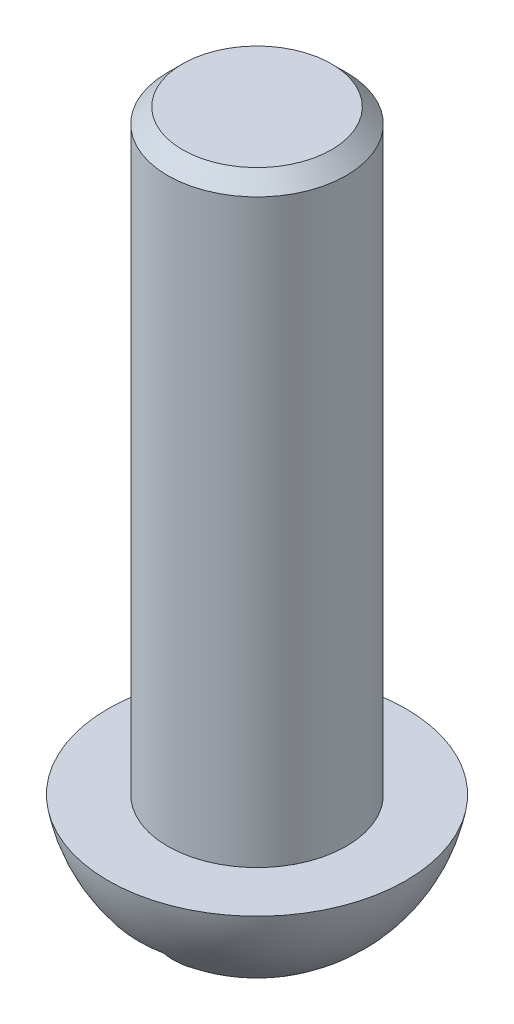
ISO-10303-21;
HEADER;
FILE_DESCRIPTION(('STEP AP214'),'2;1');
FILE_NAME('part.step','',(''),(''),'','','');
FILE_SCHEMA(('AUTOMOTIVE_DESIGN { 1 0 10303 214 1 1 1 1 }'));
ENDSEC;
DATA;
#1=APPLICATION_CONTEXT('core data for automotive mechanical design processes');
#2=APPLICATION_PROTOCOL_DEFINITION('international standard','automotive_design',2000,#1);
#3=PRODUCT_CONTEXT('',#1,'mechanical');
#4=PRODUCT('Part','Part','',(#3));
#5=PRODUCT_RELATED_PRODUCT_CATEGORY('part','',(#4));
#6=PRODUCT_DEFINITION_FORMATION('','',#4);
#7=PRODUCT_DEFINITION_CONTEXT('part definition',#1,'design');
#8=PRODUCT_DEFINITION('design','',#6,#7);
#9=PRODUCT_DEFINITION_SHAPE('','',#8);
#10=(LENGTH_UNIT() NAMED_UNIT(*) SI_UNIT(.MILLI.,.METRE.));
#11=(NAMED_UNIT(*) PLANE_ANGLE_UNIT() SI_UNIT($,.RADIAN.));
#12=(NAMED_UNIT(*) SI_UNIT($,.STERADIAN.) SOLID_ANGLE_UNIT());
#13=UNCERTAINTY_MEASURE_WITH_UNIT(LENGTH_MEASURE(1.E-05),#10,'distance_accuracy_value','');
#14=(GEOMETRIC_REPRESENTATION_CONTEXT(3) GLOBAL_UNCERTAINTY_ASSIGNED_CONTEXT((#13)) GLOBAL_UNIT_ASSIGNED_CONTEXT((#10,
#11,#12)) REPRESENTATION_CONTEXT('',''));
#15=CARTESIAN_POINT('',(0.,0.,0.));
#16=DIRECTION('',(0.,0.,1.));
#17=DIRECTION('',(1.,0.,0.));
#18=AXIS2_PLACEMENT_3D('',#15,#16,#17);
#19=CARTESIAN_POINT('',(0.,20.,0.));
#20=DIRECTION('',(0.,-1.,0.));
#21=DIRECTION('',(0.,0.,-1.));
#22=AXIS2_PLACEMENT_3D('',#19,#20,#21);
#23=CYLINDRICAL_SURFACE('',#22,3.);
#24=CARTESIAN_POINT('',(0.,19.5,0.));
#25=DIRECTION('',(0.,1.,0.));
#26=DIRECTION('',(0.,0.,1.));
#27=AXIS2_PLACEMENT_3D('',#24,#25,#26);
#28=CIRCLE('',#27,3.);
#29=CARTESIAN_POINT('',(0.,19.5,3.));
#30=VERTEX_POINT('',#29);
#31=EDGE_CURVE('E67',#30,#30,#28,.F.);
#32=ORIENTED_EDGE('',*,*,#31,.T.);
#33=EDGE_LOOP('',(#32));
#34=FACE_BOUND('',#33,.T.);
#35=CARTESIAN_POINT('',(0.,0.,0.));
#36=DIRECTION('',(0.,-1.,0.));
#37=DIRECTION('',(0.,0.,-1.));
#38=AXIS2_PLACEMENT_3D('',#35,#36,#37);
#39=CIRCLE('',#38,3.);
#40=CARTESIAN_POINT('',(0.,0.,-3.));
#41=VERTEX_POINT('',#40);
#42=EDGE_CURVE('E115',#41,#41,#39,.T.);
#43=ORIENTED_EDGE('',*,*,#42,.F.);
#44=EDGE_LOOP('',(#43));
#45=FACE_BOUND('',#44,.T.);
#46=ADVANCED_FACE('F31',(#34,#45),#23,.T.);
#47=CARTESIAN_POINT('',(0.,20.,0.));
#48=DIRECTION('',(0.,1.,0.));
#49=DIRECTION('',(0.,0.,1.));
#50=AXIS2_PLACEMENT_3D('',#47,#48,#49);
#51=PLANE('',#50);
#52=CARTESIAN_POINT('',(0.,20.,0.));
#53=DIRECTION('',(0.,1.,0.));
#54=DIRECTION('',(0.,0.,1.));
#55=AXIS2_PLACEMENT_3D('',#52,#53,#54);
#56=CIRCLE('',#55,2.5);
#57=CARTESIAN_POINT('',(0.,20.,2.5));
#58=VERTEX_POINT('',#57);
#59=EDGE_CURVE('E116',#58,#58,#56,.T.);
#60=ORIENTED_EDGE('',*,*,#59,.T.);
#61=EDGE_LOOP('',(#60));
#62=FACE_BOUND('',#61,.T.);
#63=ADVANCED_FACE('F94',(#62),#51,.T.);
#64=CARTESIAN_POINT('',(0.,20.,0.));
#65=DIRECTION('',(0.,-1.,0.));
#66=DIRECTION('',(0.,0.,-1.));
#67=AXIS2_PLACEMENT_3D('',#64,#65,#66);
#68=CONICAL_SURFACE('',#67,2.5,0.785398163397445);
#69=ORIENTED_EDGE('',*,*,#31,.F.);
#70=EDGE_LOOP('',(#69));
#71=FACE_BOUND('',#70,.T.);
#72=ORIENTED_EDGE('',*,*,#59,.F.);
#73=EDGE_LOOP('',(#72));
#74=FACE_BOUND('',#73,.T.);
#75=ADVANCED_FACE('F33',(#71,#74),#68,.T.);
#76=CARTESIAN_POINT('',(0.,0.,0.));
#77=DIRECTION('',(0.,-1.,0.));
#78=DIRECTION('',(0.,0.,-1.));
#79=AXIS2_PLACEMENT_3D('',#76,#77,#78);
#80=PLANE('',#79);
#81=CARTESIAN_POINT('',(0.,0.,0.));
#82=DIRECTION('',(0.,-1.,0.));
#83=DIRECTION('',(0.,0.,-1.));
#84=AXIS2_PLACEMENT_3D('',#81,#82,#83);
#85=CIRCLE('',#84,5.);
#86=CARTESIAN_POINT('',(0.,0.,-5.));
#87=VERTEX_POINT('',#86);
#88=EDGE_CURVE('E112',#87,#87,#85,.T.);
#89=ORIENTED_EDGE('',*,*,#88,.F.);
#90=EDGE_LOOP('',(#89));
#91=FACE_BOUND('',#90,.T.);
#92=ORIENTED_EDGE('',*,*,#42,.T.);
#93=EDGE_LOOP('',(#92));
#94=FACE_BOUND('',#93,.T.);
#95=ADVANCED_FACE('F92',(#91,#94),#80,.F.);
#96=CARTESIAN_POINT('',(0.,0.899960912816035,0.));
#97=DIRECTION('',(0.,-1.,0.));
#98=DIRECTION('',(0.,0.,-1.));
#99=AXIS2_PLACEMENT_3D('',#96,#97,#98);
#100=DEGENERATE_TOROIDAL_SURFACE('',#99,0.0199671667654691,5.1,.F.);
#101=CARTESIAN_POINT('',(0.,-2.29,0.));
#102=DIRECTION('',(0.,1.,0.));
#103=DIRECTION('',(0.,0.,1.));
#104=AXIS2_PLACEMENT_3D('',#101,#102,#103);
#105=CIRCLE('',#104,3.95924750131992);
#106=CARTESIAN_POINT('',(0.760314969587838,-2.29,-3.88555812255185));
#107=VERTEX_POINT('',#106);
#108=CARTESIAN_POINT('',(-0.760314969587838,-2.29,-3.88555812255185));
#109=VERTEX_POINT('',#108);
#110=EDGE_CURVE('E43',#107,#109,#105,.T.);
#111=ORIENTED_EDGE('',*,*,#110,.T.);
#112=CARTESIAN_POINT('',(-0.760314969587838,-4.1399954151384,0.));
#113=CARTESIAN_POINT('',(-0.760314969587838,-4.13999344087987,0.127954484447501));
#114=CARTESIAN_POINT('',(-0.760314969587838,-4.13498141562252,0.255926062135231));
#115=CARTESIAN_POINT('',(-0.760314969587838,-4.11505814588028,0.511106661475434));
#116=CARTESIAN_POINT('',(-0.760314969587838,-4.10014304774899,0.638315366814414));
#117=CARTESIAN_POINT('',(-0.760314969587838,-4.0403544493666,1.02046433942791));
#118=CARTESIAN_POINT('',(-0.760314969587838,-3.98044147943282,1.27322449777022));
#119=CARTESIAN_POINT('',(-0.760314969587838,-3.8224189485576,1.76670741010857));
#120=CARTESIAN_POINT('',(-0.760314969587838,-3.72426032339572,2.00741425181834));
#121=CARTESIAN_POINT('',(-0.760314969587838,-3.48159440506023,2.49184024609138));
#122=CARTESIAN_POINT('',(-0.760314969587838,-3.33370961229713,2.73387908764595));
#123=CARTESIAN_POINT('',(-0.760314969587838,-2.9995318846736,3.18974248725964));
#124=CARTESIAN_POINT('',(-0.760314969587838,-2.81324054014648,3.40356821296257));
#125=CARTESIAN_POINT('',(-0.760314969587838,-2.40690487653745,3.79760633980726));
#126=CARTESIAN_POINT('',(-0.760314969587838,-2.18676430136764,3.97771952892062));
#127=CARTESIAN_POINT('',(-0.760314969587838,-1.7193745131856,4.29844448559408));
#128=CARTESIAN_POINT('',(-0.760314969587838,-1.47212479880118,4.43905552240699));
#129=CARTESIAN_POINT('',(-0.760314969587838,-0.957456587186097,4.6768239810918));
#130=CARTESIAN_POINT('',(-0.760314969587838,-0.690032113396351,4.77396846691863));
#131=CARTESIAN_POINT('',(-0.760314969587838,-0.142671158554893,4.92198462172544));
#132=CARTESIAN_POINT('',(-0.760314969587838,0.137265293589944,4.97285639760515));
#133=CARTESIAN_POINT('',(-0.760314969587838,0.701724418877609,5.02688618214177));
#134=CARTESIAN_POINT('',(-0.760314969587838,0.98624739605957,5.03004101453046));
#135=CARTESIAN_POINT('',(-0.760314969587838,1.55178457115843,4.98853913164834));
#136=CARTESIAN_POINT('',(-0.760314969587838,1.83279877037742,4.94388243412067));
#137=CARTESIAN_POINT('',(-0.760314969587838,2.38334377533671,4.80802421821285));
#138=CARTESIAN_POINT('',(-0.760314969587838,2.65287448591163,4.71682231418693));
#139=CARTESIAN_POINT('',(-0.760314969587838,3.17279985161443,4.49046129471542));
#140=CARTESIAN_POINT('',(-0.760314969587838,3.42319439900679,4.35530193181433));
#141=CARTESIAN_POINT('',(-0.760314969587838,3.89773343428311,4.0448628530727));
#142=CARTESIAN_POINT('',(-0.760314969587838,4.12187826901511,3.86958366744199));
#143=CARTESIAN_POINT('',(-0.760314969587838,4.5375497338974,3.48388673594852));
#144=CARTESIAN_POINT('',(-0.760314969587838,4.7290772625676,3.27346995834921));
#145=CARTESIAN_POINT('',(-0.760314969587838,5.07405404925481,2.82348462648775));
#146=CARTESIAN_POINT('',(-0.760314969587838,5.22750900239963,2.58392044027267));
#147=CARTESIAN_POINT('',(-0.760314969587838,5.49201404548678,2.08242923430107));
#148=CARTESIAN_POINT('',(-0.760314969587838,5.60305891033248,1.82049946387402));
#149=CARTESIAN_POINT('',(-0.760314969587838,5.77950024242442,1.2816324952403));
#150=CARTESIAN_POINT('',(-0.760314969587838,5.84491291672879,1.00470066297193));
#151=CARTESIAN_POINT('',(-0.760314969587838,5.90717290803482,0.584310333151226));
#152=CARTESIAN_POINT('',(-0.760314969587838,5.92194870603938,0.443301641807225));
#153=CARTESIAN_POINT('',(-0.760314969587838,5.9393244879133,0.160538202862194));
#154=CARTESIAN_POINT('',(-0.760314969587838,5.94192514467346,0.0187834969251087));
#155=CARTESIAN_POINT('',(-0.760314969587838,5.9313793681331,-0.402617368839939));
#156=CARTESIAN_POINT('',(-0.760314969587838,5.9004156037854,-0.682007545966104));
#157=CARTESIAN_POINT('',(-0.760314969587838,5.79237964652561,-1.23160896426513));
#158=CARTESIAN_POINT('',(-0.760314969587838,5.71529567700566,-1.5018178424007));
#159=CARTESIAN_POINT('',(-0.760314969587838,5.51704249415146,-2.02646155129989));
#160=CARTESIAN_POINT('',(-0.760314969587838,5.39575022519364,-2.28085000865695));
#161=CARTESIAN_POINT('',(-0.760314969587838,5.11255001467152,-2.76585798865953));
#162=CARTESIAN_POINT('',(-0.760314969587838,4.95064648554385,-2.99648008969519));
#163=CARTESIAN_POINT('',(-0.760314969587838,4.58911281977496,-3.42952962130032));
#164=CARTESIAN_POINT('',(-0.760314969587838,4.38915691716896,-3.63168523191273));
#165=CARTESIAN_POINT('',(-0.760314969587838,3.95814881354292,-3.99959064357048));
#166=CARTESIAN_POINT('',(-0.760314969587838,3.72709449885994,-4.16533796803999));
#167=CARTESIAN_POINT('',(-0.760314969587838,3.24032017071268,-4.45579422476121));
#168=CARTESIAN_POINT('',(-0.760314969587838,2.98458701291754,-4.58048112986882));
#169=CARTESIAN_POINT('',(-0.760314969587838,2.45582326638365,-4.78515379175193));
#170=CARTESIAN_POINT('',(-0.760314969587838,2.18279295667286,-4.86514026940537));
#171=CARTESIAN_POINT('',(-0.760314969587838,1.62714952147132,-4.97815238989791));
#172=CARTESIAN_POINT('',(-0.760314969587838,1.34453536311233,-5.0111729545647));
#173=CARTESIAN_POINT('',(-0.760314969587838,0.777773904305402,-5.02929975795834));
#174=CARTESIAN_POINT('',(-0.760314969587838,0.493626599823449,-5.01440587055107));
#175=CARTESIAN_POINT('',(-0.760314969587838,-0.0681381638882343,-4.9371257511514));
#176=CARTESIAN_POINT('',(-0.760314969587838,-0.345755543561088,-4.87473894084099));
#177=CARTESIAN_POINT('',(-0.760314969587838,-0.886581153743582,-4.70424105529965));
#178=CARTESIAN_POINT('',(-0.760314969587838,-1.1497891143817,-4.59612912402147));
#179=CARTESIAN_POINT('',(-0.760314969587838,-1.65432725353946,-4.33724441091022));
#180=CARTESIAN_POINT('',(-0.760314969587838,-1.89565660457356,-4.1864700163996));
#181=CARTESIAN_POINT('',(-0.760314969587838,-2.34954642030442,-3.84656017202554));
#182=CARTESIAN_POINT('',(-0.760314969587838,-2.56211029225881,-3.65742927211504));
#183=CARTESIAN_POINT('',(-0.760314969587838,-2.95240773428329,-3.24622602937785));
#184=CARTESIAN_POINT('',(-0.760314969587838,-3.13015144678598,-3.02416331215856));
#185=CARTESIAN_POINT('',(-0.760314969587838,-3.44592664720368,-2.55320155812652));
#186=CARTESIAN_POINT('',(-0.760314969587838,-3.58393549249063,-2.30428733078537));
#187=CARTESIAN_POINT('',(-0.760314969587838,-3.81621743654735,-1.78669438578541));
#188=CARTESIAN_POINT('',(-0.760314969587838,-3.91046466119597,-1.51800408397107));
#189=CARTESIAN_POINT('',(-0.760314969587838,-4.05219157509136,-0.969029673137948));
#190=CARTESIAN_POINT('',(-0.760314969587838,-4.09977771580294,-0.688773480924518));
#191=CARTESIAN_POINT('',(-0.760314969587838,-4.13436086978986,-0.271471643857912));
#192=CARTESIAN_POINT('',(-0.760314969587838,-4.13999750960657,-0.135745441016641));
#193=CARTESIAN_POINT('',(-0.760314969587838,-4.1399954151384,0.));
#194=B_SPLINE_CURVE_WITH_KNOTS('',3,(#112,#113,#114,#115,#116,#117,#118,#119,#120,#121,#122,
#123,#124,#125,#126,#127,#128,#129,#130,#131,#132,#133,#134,#135,#136,#137,#138,#139,#140,#141,
#142,#143,#144,#145,#146,#147,#148,#149,#150,#151,#152,#153,#154,#155,#156,#157,#158,#159,#160,
#161,#162,#163,#164,#165,#166,#167,#168,#169,#170,#171,#172,#173,#174,#175,#176,#177,#178,#179,
#180,#181,#182,#183,#184,#185,#186,#187,#188,#189,#190,#191,#192,#193),.UNSPECIFIED.,.T.,.F.,(4,
2,2,2,2,2,2,2,2,2,2,2,2,2,2,2,2,2,2,2,2,2,2,2,2,2,2,2,2,2,2,2,2,2,2,2,2,2,2,2,4),(0.,
0.383783744943779,0.767716921719448,1.54360650505359,2.32049474895569,3.16733556250473,
4.01414131722434,4.86340123210623,5.71267685634528,6.56220506497437,7.41173131100915,
8.26131410532949,9.11089658436445,9.96048610264642,10.810080403717,11.6596634774884,
12.5092231437215,13.3586556509188,14.2081927779465,15.0574280234092,15.4823209940668,
15.9071904816335,16.7461376868262,17.5852992052745,18.4268146297079,19.2682386625834,
20.1172195772836,20.9662582237584,21.8157516036673,22.6652312835127,23.5148028060601,
24.3643765650944,25.2139606694947,26.0635606801695,26.9131928107419,27.7627242145305,
28.6120077972711,29.4617743846099,30.3120427599024,31.1603668088846,31.567518570211),.UNSPECIFIED.);
#195=CARTESIAN_POINT('',(-0.760314969587838,-2.29,3.88555812255185));
#196=VERTEX_POINT('',#195);
#197=EDGE_CURVE('E11',#109,#196,#194,.T.);
#198=ORIENTED_EDGE('',*,*,#197,.T.);
#199=CARTESIAN_POINT('',(0.760314969587838,-2.29,3.88555812255185));
#200=VERTEX_POINT('',#199);
#201=EDGE_CURVE('E56',#196,#200,#105,.T.);
#202=ORIENTED_EDGE('',*,*,#201,.T.);
#203=CARTESIAN_POINT('',(0.760314969587839,-4.1399954151384,0.));
#204=CARTESIAN_POINT('',(0.760314969587839,-4.13999344087987,-0.127954484447501));
#205=CARTESIAN_POINT('',(0.760314969587839,-4.13498141562252,-0.255926062135231));
#206=CARTESIAN_POINT('',(0.760314969587839,-4.11505814588028,-0.511106661475434));
#207=CARTESIAN_POINT('',(0.760314969587839,-4.10014304774899,-0.638315366814414));
#208=CARTESIAN_POINT('',(0.760314969587839,-4.0403544493666,-1.02046433942791));
#209=CARTESIAN_POINT('',(0.760314969587839,-3.98044147943282,-1.27322449777022));
#210=CARTESIAN_POINT('',(0.760314969587839,-3.8224189485576,-1.76670741010857));
#211=CARTESIAN_POINT('',(0.760314969587839,-3.72426032339572,-2.00741425181834));
#212=CARTESIAN_POINT('',(0.760314969587839,-3.48159440506023,-2.49184024609138));
#213=CARTESIAN_POINT('',(0.760314969587839,-3.33370961229713,-2.73387908764595));
#214=CARTESIAN_POINT('',(0.760314969587839,-2.9995318846736,-3.18974248725964));
#215=CARTESIAN_POINT('',(0.760314969587838,-2.81324054014648,-3.40356821296257));
#216=CARTESIAN_POINT('',(0.760314969587838,-2.40690487653745,-3.79760633980726));
#217=CARTESIAN_POINT('',(0.760314969587838,-2.18676430136764,-3.97771952892062));
#218=CARTESIAN_POINT('',(0.760314969587838,-1.7193745131856,-4.29844448559408));
#219=CARTESIAN_POINT('',(0.760314969587838,-1.47212479880118,-4.43905552240699));
#220=CARTESIAN_POINT('',(0.760314969587838,-0.957456587186097,-4.6768239810918));
#221=CARTESIAN_POINT('',(0.760314969587838,-0.690032113396351,-4.77396846691863));
#222=CARTESIAN_POINT('',(0.760314969587838,-0.142671158554893,-4.92198462172544));
#223=CARTESIAN_POINT('',(0.760314969587838,0.137265293589944,-4.97285639760515));
#224=CARTESIAN_POINT('',(0.760314969587838,0.701724418877609,-5.02688618214177));
#225=CARTESIAN_POINT('',(0.760314969587838,0.98624739605957,-5.03004101453046));
#226=CARTESIAN_POINT('',(0.760314969587838,1.55178457115843,-4.98853913164834));
#227=CARTESIAN_POINT('',(0.760314969587838,1.83279877037742,-4.94388243412067));
#228=CARTESIAN_POINT('',(0.760314969587838,2.38334377533671,-4.80802421821285));
#229=CARTESIAN_POINT('',(0.760314969587838,2.65287448591163,-4.71682231418693));
#230=CARTESIAN_POINT('',(0.760314969587838,3.17279985161443,-4.49046129471542));
#231=CARTESIAN_POINT('',(0.760314969587838,3.42319439900679,-4.35530193181433));
#232=CARTESIAN_POINT('',(0.760314969587838,3.89773343428311,-4.0448628530727));
#233=CARTESIAN_POINT('',(0.760314969587838,4.12187826901511,-3.86958366744199));
#234=CARTESIAN_POINT('',(0.760314969587838,4.5375497338974,-3.48388673594852));
#235=CARTESIAN_POINT('',(0.760314969587838,4.72907726256761,-3.27346995834921));
#236=CARTESIAN_POINT('',(0.760314969587838,5.07405404925481,-2.82348462648775));
#237=CARTESIAN_POINT('',(0.760314969587838,5.22750900239963,-2.58392044027267));
#238=CARTESIAN_POINT('',(0.760314969587838,5.49201404548678,-2.08242923430107));
#239=CARTESIAN_POINT('',(0.760314969587838,5.60305891033248,-1.82049946387402));
#240=CARTESIAN_POINT('',(0.760314969587838,5.77950024242442,-1.2816324952403));
#241=CARTESIAN_POINT('',(0.760314969587838,5.84491291672879,-1.00470066297193));
#242=CARTESIAN_POINT('',(0.760314969587838,5.90717290803482,-0.584310333151227));
#243=CARTESIAN_POINT('',(0.760314969587838,5.92194870603938,-0.443301641807226));
#244=CARTESIAN_POINT('',(0.760314969587838,5.9393244879133,-0.160538202862195));
#245=CARTESIAN_POINT('',(0.760314969587838,5.94192514467346,-0.0187834969251099));
#246=CARTESIAN_POINT('',(0.760314969587838,5.93137936813311,0.402617368839937));
#247=CARTESIAN_POINT('',(0.760314969587838,5.9004156037854,0.682007545966102));
#248=CARTESIAN_POINT('',(0.760314969587838,5.79237964652561,1.23160896426513));
#249=CARTESIAN_POINT('',(0.760314969587838,5.71529567700566,1.50181784240069));
#250=CARTESIAN_POINT('',(0.760314969587838,5.51704249415147,2.02646155129989));
#251=CARTESIAN_POINT('',(0.760314969587838,5.39575022519364,2.28085000865695));
#252=CARTESIAN_POINT('',(0.760314969587838,5.11255001467152,2.76585798865953));
#253=CARTESIAN_POINT('',(0.760314969587838,4.95064648554385,2.99648008969519));
#254=CARTESIAN_POINT('',(0.760314969587838,4.58911281977496,3.42952962130032));
#255=CARTESIAN_POINT('',(0.760314969587838,4.38915691716896,3.63168523191273));
#256=CARTESIAN_POINT('',(0.760314969587838,3.95814881354292,3.99959064357048));
#257=CARTESIAN_POINT('',(0.760314969587838,3.72709449885994,4.16533796803999));
#258=CARTESIAN_POINT('',(0.760314969587838,3.24032017071268,4.45579422476121));
#259=CARTESIAN_POINT('',(0.760314969587838,2.98458701291754,4.58048112986882));
#260=CARTESIAN_POINT('',(0.760314969587838,2.45582326638366,4.78515379175193));
#261=CARTESIAN_POINT('',(0.760314969587838,2.18279295667286,4.86514026940537));
#262=CARTESIAN_POINT('',(0.760314969587838,1.62714952147132,4.97815238989791));
#263=CARTESIAN_POINT('',(0.760314969587838,1.34453536311233,5.0111729545647));
#264=CARTESIAN_POINT('',(0.760314969587838,0.777773904305403,5.02929975795834));
#265=CARTESIAN_POINT('',(0.760314969587838,0.49362659982345,5.01440587055107));
#266=CARTESIAN_POINT('',(0.760314969587838,-0.0681381638882334,4.9371257511514));
#267=CARTESIAN_POINT('',(0.760314969587838,-0.345755543561087,4.87473894084099));
#268=CARTESIAN_POINT('',(0.760314969587838,-0.886581153743581,4.70424105529965));
#269=CARTESIAN_POINT('',(0.760314969587838,-1.1497891143817,4.59612912402147));
#270=CARTESIAN_POINT('',(0.760314969587838,-1.65432725353946,4.33724441091022));
#271=CARTESIAN_POINT('',(0.760314969587838,-1.89565660457356,4.1864700163996));
#272=CARTESIAN_POINT('',(0.760314969587838,-2.34954642030442,3.84656017202554));
#273=CARTESIAN_POINT('',(0.760314969587838,-2.56211029225881,3.65742927211504));
#274=CARTESIAN_POINT('',(0.760314969587838,-2.95240773428329,3.24622602937785));
#275=CARTESIAN_POINT('',(0.760314969587839,-3.13015144678598,3.02416331215857));
#276=CARTESIAN_POINT('',(0.760314969587839,-3.44592664720368,2.55320155812652));
#277=CARTESIAN_POINT('',(0.760314969587839,-3.58393549249063,2.30428733078537));
#278=CARTESIAN_POINT('',(0.760314969587839,-3.81621743654735,1.78669438578541));
#279=CARTESIAN_POINT('',(0.760314969587839,-3.91046466119596,1.51800408397107));
#280=CARTESIAN_POINT('',(0.760314969587839,-4.05219157509136,0.969029673137948));
#281=CARTESIAN_POINT('',(0.760314969587839,-4.09977771580294,0.688773480924519));
#282=CARTESIAN_POINT('',(0.760314969587839,-4.13436086978986,0.271471643857912));
#283=CARTESIAN_POINT('',(0.760314969587839,-4.13999750960657,0.135745441016641));
#284=CARTESIAN_POINT('',(0.760314969587839,-4.1399954151384,0.));
#285=B_SPLINE_CURVE_WITH_KNOTS('',3,(#203,#204,#205,#206,#207,#208,#209,#210,#211,#212,#213,
#214,#215,#216,#217,#218,#219,#220,#221,#222,#223,#224,#225,#226,#227,#228,#229,#230,#231,#232,
#233,#234,#235,#236,#237,#238,#239,#240,#241,#242,#243,#244,#245,#246,#247,#248,#249,#250,#251,
#252,#253,#254,#255,#256,#257,#258,#259,#260,#261,#262,#263,#264,#265,#266,#267,#268,#269,#270,
#271,#272,#273,#274,#275,#276,#277,#278,#279,#280,#281,#282,#283,#284),.UNSPECIFIED.,.T.,.F.,(4,
2,2,2,2,2,2,2,2,2,2,2,2,2,2,2,2,2,2,2,2,2,2,2,2,2,2,2,2,2,2,2,2,2,2,2,2,2,2,2,4),(0.,
0.383783744943779,0.767716921719448,1.54360650505359,2.32049474895569,3.16733556250473,
4.01414131722434,4.86340123210623,5.71267685634528,6.56220506497437,7.41173131100915,
8.26131410532949,9.11089658436445,9.96048610264642,10.810080403717,11.6596634774884,
12.5092231437215,13.3586556509188,14.2081927779465,15.0574280234092,15.4823209940668,
15.9071904816335,16.7461376868262,17.5852992052745,18.4268146297079,19.2682386625834,
20.1172195772836,20.9662582237584,21.8157516036673,22.6652312835127,23.5148028060601,
24.3643765650944,25.2139606694947,26.0635606801695,26.9131928107419,27.7627242145305,
28.6120077972711,29.4617743846099,30.3120427599024,31.1603668088846,31.567518570211),.UNSPECIFIED.);
#286=EDGE_CURVE('E63',#200,#107,#285,.T.);
#287=ORIENTED_EDGE('',*,*,#286,.T.);
#288=EDGE_LOOP('',(#111,#198,#202,#287));
#289=FACE_BOUND('',#288,.T.);
#290=ORIENTED_EDGE('',*,*,#88,.T.);
#291=EDGE_LOOP('',(#290));
#292=FACE_BOUND('',#291,.T.);
#293=ADVANCED_FACE('F72',(#289,#292),#100,.F.);
#294=CARTESIAN_POINT('',(-0.760314969587838,-6.22806179955192,-5.));
#295=DIRECTION('',(-1.,0.,0.));
#296=DIRECTION('',(0.,0.,1.));
#297=AXIS2_PLACEMENT_3D('',#294,#295,#296);
#298=PLANE('',#297);
#299=DIRECTION('',(0.,0.,1.));
#300=VECTOR('',#299,1.);
#301=CARTESIAN_POINT('',(-0.760314969587838,-2.29,-5.));
#302=LINE('',#301,#300);
#303=EDGE_CURVE('E70',#109,#196,#302,.T.);
#304=ORIENTED_EDGE('',*,*,#303,.T.);
#305=ORIENTED_EDGE('',*,*,#197,.F.);
#306=EDGE_LOOP('',(#304,#305));
#307=FACE_BOUND('',#306,.T.);
#308=ADVANCED_FACE('F84',(#307),#298,.F.);
#309=CARTESIAN_POINT('',(-0.760314969587838,-2.29,-5.));
#310=DIRECTION('',(0.,1.,0.));
#311=DIRECTION('',(0.,0.,1.));
#312=AXIS2_PLACEMENT_3D('',#309,#310,#311);
#313=PLANE('',#312);
#314=DIRECTION('',(0.,0.,1.));
#315=VECTOR('',#314,1.);
#316=CARTESIAN_POINT('',(0.760314969587838,-2.29,-5.));
#317=LINE('',#316,#315);
#318=EDGE_CURVE('E49',#107,#200,#317,.T.);
#319=ORIENTED_EDGE('',*,*,#318,.T.);
#320=ORIENTED_EDGE('',*,*,#201,.F.);
#321=ORIENTED_EDGE('',*,*,#303,.F.);
#322=ORIENTED_EDGE('',*,*,#110,.F.);
#323=EDGE_LOOP('',(#319,#320,#321,#322));
#324=FACE_BOUND('',#323,.T.);
#325=ADVANCED_FACE('F69',(#324),#313,.F.);
#326=CARTESIAN_POINT('',(0.760314969587838,-2.29,-5.));
#327=DIRECTION('',(1.,0.,0.));
#328=DIRECTION('',(0.,1.,0.));
#329=AXIS2_PLACEMENT_3D('',#326,#327,#328);
#330=PLANE('',#329);
#331=ORIENTED_EDGE('',*,*,#318,.F.);
#332=ORIENTED_EDGE('',*,*,#286,.F.);
#333=EDGE_LOOP('',(#331,#332));
#334=FACE_BOUND('',#333,.T.);
#335=ADVANCED_FACE('F64',(#334),#330,.F.);
#336=CLOSED_SHELL('',(#46,#63,#75,#95,#293,#308,#325,#335));
#337=MANIFOLD_SOLID_BREP('B2',#336);
#338=ADVANCED_BREP_SHAPE_REPRESENTATION('',(#18,#337),#14);
#339=SHAPE_DEFINITION_REPRESENTATION(#9,#338);
ENDSEC;
END-ISO-10303-21;
